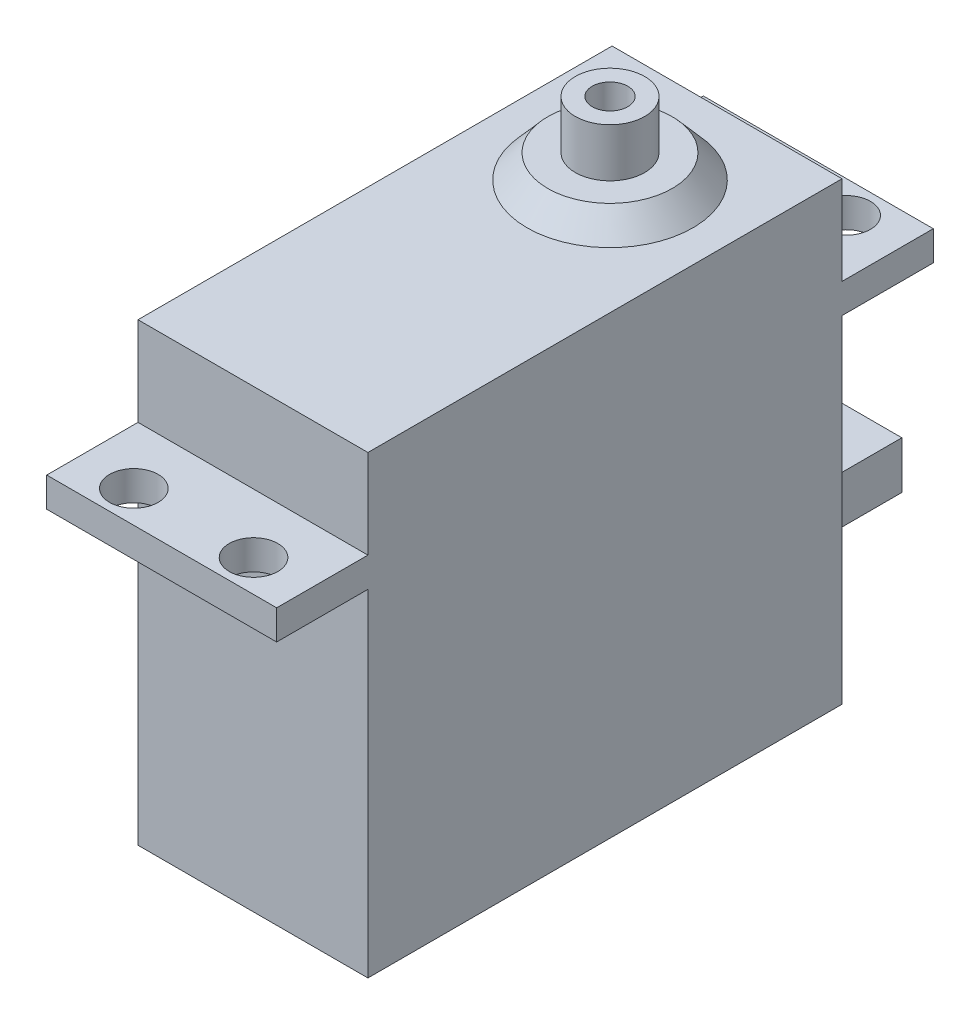
ISO-10303-21;
HEADER;
FILE_DESCRIPTION(('STEP AP214'),'2;1');
FILE_NAME('part.step','',(''),(''),'','','');
FILE_SCHEMA(('AUTOMOTIVE_DESIGN { 1 0 10303 214 1 1 1 1 }'));
ENDSEC;
DATA;
#1=APPLICATION_CONTEXT('core data for automotive mechanical design processes');
#2=APPLICATION_PROTOCOL_DEFINITION('international standard','automotive_design',2000,#1);
#3=PRODUCT_CONTEXT('',#1,'mechanical');
#4=PRODUCT('Part','Part','',(#3));
#5=PRODUCT_RELATED_PRODUCT_CATEGORY('part','',(#4));
#6=PRODUCT_DEFINITION_FORMATION('','',#4);
#7=PRODUCT_DEFINITION_CONTEXT('part definition',#1,'design');
#8=PRODUCT_DEFINITION('design','',#6,#7);
#9=PRODUCT_DEFINITION_SHAPE('','',#8);
#10=(LENGTH_UNIT() NAMED_UNIT(*) SI_UNIT(.MILLI.,.METRE.));
#11=(NAMED_UNIT(*) PLANE_ANGLE_UNIT() SI_UNIT($,.RADIAN.));
#12=(NAMED_UNIT(*) SI_UNIT($,.STERADIAN.) SOLID_ANGLE_UNIT());
#13=UNCERTAINTY_MEASURE_WITH_UNIT(LENGTH_MEASURE(1.E-05),#10,'distance_accuracy_value','');
#14=(GEOMETRIC_REPRESENTATION_CONTEXT(3) GLOBAL_UNCERTAINTY_ASSIGNED_CONTEXT((#13)) GLOBAL_UNIT_ASSIGNED_CONTEXT((#10,
#11,#12)) REPRESENTATION_CONTEXT('',''));
#15=CARTESIAN_POINT('',(0.,0.,0.));
#16=DIRECTION('',(0.,0.,1.));
#17=DIRECTION('',(1.,0.,0.));
#18=AXIS2_PLACEMENT_3D('',#15,#16,#17);
#19=CARTESIAN_POINT('',(0.,-28.4,-20.));
#20=DIRECTION('',(0.,0.,1.));
#21=DIRECTION('',(1.,0.,0.));
#22=AXIS2_PLACEMENT_3D('',#19,#20,#21);
#23=PLANE('',#22);
#24=DIRECTION('',(1.,0.,0.));
#25=VECTOR('',#24,1.);
#26=CARTESIAN_POINT('',(0.,0.,-20.));
#27=LINE('',#26,#25);
#28=CARTESIAN_POINT('',(-9.7,0.,-20.));
#29=VERTEX_POINT('',#28);
#30=CARTESIAN_POINT('',(9.7,0.,-20.));
#31=VERTEX_POINT('',#30);
#32=EDGE_CURVE('E480',#29,#31,#27,.T.);
#33=ORIENTED_EDGE('',*,*,#32,.T.);
#34=DIRECTION('',(0.,1.,0.));
#35=VECTOR('',#34,1.);
#36=CARTESIAN_POINT('',(9.7,-28.4,-20.));
#37=LINE('',#36,#35);
#38=CARTESIAN_POINT('',(9.7,-28.4,-20.));
#39=VERTEX_POINT('',#38);
#40=EDGE_CURVE('E500',#39,#31,#37,.T.);
#41=ORIENTED_EDGE('',*,*,#40,.F.);
#42=DIRECTION('',(1.,0.,0.));
#43=VECTOR('',#42,1.);
#44=CARTESIAN_POINT('',(0.,-28.4,-20.));
#45=LINE('',#44,#43);
#46=CARTESIAN_POINT('',(-9.7,-28.4,-20.));
#47=VERTEX_POINT('',#46);
#48=EDGE_CURVE('E491',#47,#39,#45,.T.);
#49=ORIENTED_EDGE('',*,*,#48,.F.);
#50=DIRECTION('',(0.,1.,0.));
#51=VECTOR('',#50,1.);
#52=CARTESIAN_POINT('',(-9.7,-28.4,-20.));
#53=LINE('',#52,#51);
#54=EDGE_CURVE('E508',#47,#29,#53,.T.);
#55=ORIENTED_EDGE('',*,*,#54,.T.);
#56=EDGE_LOOP('',(#33,#41,#49,#55));
#57=FACE_BOUND('',#56,.T.);
#58=DIRECTION('',(0.,1.,0.));
#59=VECTOR('',#58,1.);
#60=CARTESIAN_POINT('',(-4.,-17.4,-20.));
#61=LINE('',#60,#59);
#62=CARTESIAN_POINT('',(-4.,-23.4,-20.));
#63=VERTEX_POINT('',#62);
#64=CARTESIAN_POINT('',(-4.,-17.4,-20.));
#65=VERTEX_POINT('',#64);
#66=EDGE_CURVE('E207',#63,#65,#61,.T.);
#67=ORIENTED_EDGE('',*,*,#66,.F.);
#68=DIRECTION('',(-1.,0.,0.));
#69=VECTOR('',#68,1.);
#70=CARTESIAN_POINT('',(4.,-23.4,-20.));
#71=LINE('',#70,#69);
#72=CARTESIAN_POINT('',(4.,-23.4,-20.));
#73=VERTEX_POINT('',#72);
#74=EDGE_CURVE('E220',#73,#63,#71,.T.);
#75=ORIENTED_EDGE('',*,*,#74,.F.);
#76=DIRECTION('',(0.,-1.,0.));
#77=VECTOR('',#76,1.);
#78=CARTESIAN_POINT('',(4.,-17.4,-20.));
#79=LINE('',#78,#77);
#80=CARTESIAN_POINT('',(4.,-17.4,-20.));
#81=VERTEX_POINT('',#80);
#82=EDGE_CURVE('E229',#81,#73,#79,.T.);
#83=ORIENTED_EDGE('',*,*,#82,.F.);
#84=DIRECTION('',(1.,0.,0.));
#85=VECTOR('',#84,1.);
#86=CARTESIAN_POINT('',(4.,-17.4,-20.));
#87=LINE('',#86,#85);
#88=EDGE_CURVE('E210',#65,#81,#87,.T.);
#89=ORIENTED_EDGE('',*,*,#88,.F.);
#90=EDGE_LOOP('',(#67,#75,#83,#89));
#91=FACE_BOUND('',#90,.T.);
#92=ADVANCED_FACE('F49',(#57,#91),#23,.F.);
#93=CARTESIAN_POINT('',(0.,2.5,0.));
#94=DIRECTION('',(0.,1.,0.));
#95=DIRECTION('',(0.,0.,1.));
#96=AXIS2_PLACEMENT_3D('',#93,#94,#95);
#97=PLANE('',#96);
#98=CARTESIAN_POINT('',(-5.05,2.5,25.));
#99=DIRECTION('',(0.,1.,0.));
#100=DIRECTION('',(0.,0.,1.));
#101=AXIS2_PLACEMENT_3D('',#98,#99,#100);
#102=CIRCLE('',#101,2.05);
#103=CARTESIAN_POINT('',(-5.05,2.5,27.05));
#104=VERTEX_POINT('',#103);
#105=EDGE_CURVE('E526',#104,#104,#102,.F.);
#106=ORIENTED_EDGE('',*,*,#105,.T.);
#107=EDGE_LOOP('',(#106));
#108=FACE_BOUND('',#107,.T.);
#109=CARTESIAN_POINT('',(5.05,2.5,25.));
#110=DIRECTION('',(0.,1.,0.));
#111=DIRECTION('',(0.,0.,1.));
#112=AXIS2_PLACEMENT_3D('',#109,#110,#111);
#113=CIRCLE('',#112,2.05);
#114=CARTESIAN_POINT('',(5.05,2.5,27.05));
#115=VERTEX_POINT('',#114);
#116=EDGE_CURVE('E523',#115,#115,#113,.F.);
#117=ORIENTED_EDGE('',*,*,#116,.T.);
#118=EDGE_LOOP('',(#117));
#119=FACE_BOUND('',#118,.T.);
#120=DIRECTION('',(0.,0.,1.));
#121=VECTOR('',#120,1.);
#122=CARTESIAN_POINT('',(9.7,2.5,0.));
#123=LINE('',#122,#121);
#124=CARTESIAN_POINT('',(9.7,2.5,20.));
#125=VERTEX_POINT('',#124);
#126=CARTESIAN_POINT('',(9.7,2.5,27.7));
#127=VERTEX_POINT('',#126);
#128=EDGE_CURVE('E438',#125,#127,#123,.T.);
#129=ORIENTED_EDGE('',*,*,#128,.F.);
#130=DIRECTION('',(-1.,0.,0.));
#131=VECTOR('',#130,1.);
#132=CARTESIAN_POINT('',(0.,2.5,20.));
#133=LINE('',#132,#131);
#134=CARTESIAN_POINT('',(-9.69999999999999,2.5,20.));
#135=VERTEX_POINT('',#134);
#136=EDGE_CURVE('E461',#125,#135,#133,.T.);
#137=ORIENTED_EDGE('',*,*,#136,.T.);
#138=DIRECTION('',(0.,0.,1.));
#139=VECTOR('',#138,1.);
#140=CARTESIAN_POINT('',(-9.69999999999999,2.5,0.));
#141=LINE('',#140,#139);
#142=CARTESIAN_POINT('',(-9.69999999999999,2.5,27.7));
#143=VERTEX_POINT('',#142);
#144=EDGE_CURVE('E517',#135,#143,#141,.T.);
#145=ORIENTED_EDGE('',*,*,#144,.T.);
#146=DIRECTION('',(1.,0.,0.));
#147=VECTOR('',#146,1.);
#148=CARTESIAN_POINT('',(0.,2.5,27.7));
#149=LINE('',#148,#147);
#150=EDGE_CURVE('E520',#143,#127,#149,.T.);
#151=ORIENTED_EDGE('',*,*,#150,.T.);
#152=EDGE_LOOP('',(#129,#137,#145,#151));
#153=FACE_BOUND('',#152,.T.);
#154=ADVANCED_FACE('F364',(#108,#119,#153),#97,.T.);
#155=CARTESIAN_POINT('',(0.,0.,0.));
#156=DIRECTION('',(0.,1.,0.));
#157=DIRECTION('',(0.,0.,1.));
#158=AXIS2_PLACEMENT_3D('',#155,#156,#157);
#159=PLANE('',#158);
#160=CARTESIAN_POINT('',(-5.05,0.,-25.));
#161=DIRECTION('',(0.,1.,0.));
#162=DIRECTION('',(0.,0.,1.));
#163=AXIS2_PLACEMENT_3D('',#160,#161,#162);
#164=CIRCLE('',#163,2.05);
#165=CARTESIAN_POINT('',(-5.05,0.,-22.95));
#166=VERTEX_POINT('',#165);
#167=EDGE_CURVE('E432',#166,#166,#164,.T.);
#168=ORIENTED_EDGE('',*,*,#167,.T.);
#169=EDGE_LOOP('',(#168));
#170=FACE_BOUND('',#169,.T.);
#171=CARTESIAN_POINT('',(5.05,0.,-25.));
#172=DIRECTION('',(0.,1.,0.));
#173=DIRECTION('',(0.,0.,1.));
#174=AXIS2_PLACEMENT_3D('',#171,#172,#173);
#175=CIRCLE('',#174,2.05);
#176=CARTESIAN_POINT('',(5.05,0.,-22.95));
#177=VERTEX_POINT('',#176);
#178=EDGE_CURVE('E435',#177,#177,#175,.T.);
#179=ORIENTED_EDGE('',*,*,#178,.T.);
#180=EDGE_LOOP('',(#179));
#181=FACE_BOUND('',#180,.T.);
#182=ORIENTED_EDGE('',*,*,#32,.F.);
#183=DIRECTION('',(0.,0.,1.));
#184=VECTOR('',#183,1.);
#185=CARTESIAN_POINT('',(-9.69999999999999,0.,0.));
#186=LINE('',#185,#184);
#187=CARTESIAN_POINT('',(-9.69999999999999,0.,-27.7));
#188=VERTEX_POINT('',#187);
#189=EDGE_CURVE('E416',#188,#29,#186,.T.);
#190=ORIENTED_EDGE('',*,*,#189,.F.);
#191=DIRECTION('',(1.,0.,0.));
#192=VECTOR('',#191,1.);
#193=CARTESIAN_POINT('',(0.,0.,-27.7));
#194=LINE('',#193,#192);
#195=CARTESIAN_POINT('',(9.7,0.,-27.7));
#196=VERTEX_POINT('',#195);
#197=EDGE_CURVE('E406',#188,#196,#194,.T.);
#198=ORIENTED_EDGE('',*,*,#197,.T.);
#199=DIRECTION('',(0.,0.,1.));
#200=VECTOR('',#199,1.);
#201=CARTESIAN_POINT('',(9.7,0.,0.));
#202=LINE('',#201,#200);
#203=EDGE_CURVE('E414',#196,#31,#202,.T.);
#204=ORIENTED_EDGE('',*,*,#203,.T.);
#205=EDGE_LOOP('',(#182,#190,#198,#204));
#206=FACE_BOUND('',#205,.T.);
#207=ADVANCED_FACE('F374',(#170,#181,#206),#159,.F.);
#208=CARTESIAN_POINT('',(9.7,2.5,0.));
#209=DIRECTION('',(1.,0.,0.));
#210=DIRECTION('',(0.,0.,-1.));
#211=AXIS2_PLACEMENT_3D('',#208,#209,#210);
#212=PLANE('',#211);
#213=ORIENTED_EDGE('',*,*,#203,.F.);
#214=DIRECTION('',(0.,-1.,0.));
#215=VECTOR('',#214,1.);
#216=CARTESIAN_POINT('',(9.7,2.5,-27.7));
#217=LINE('',#216,#215);
#218=CARTESIAN_POINT('',(9.7,2.5,-27.7));
#219=VERTEX_POINT('',#218);
#220=EDGE_CURVE('E12',#219,#196,#217,.T.);
#221=ORIENTED_EDGE('',*,*,#220,.F.);
#222=CARTESIAN_POINT('',(9.7,2.5,-20.));
#223=VERTEX_POINT('',#222);
#224=EDGE_CURVE('E512',#219,#223,#123,.T.);
#225=ORIENTED_EDGE('',*,*,#224,.T.);
#226=DIRECTION('',(0.,-1.,0.));
#227=VECTOR('',#226,1.);
#228=CARTESIAN_POINT('',(9.7,10.,-20.));
#229=LINE('',#228,#227);
#230=CARTESIAN_POINT('',(9.7,10.,-20.));
#231=VERTEX_POINT('',#230);
#232=EDGE_CURVE('E481',#231,#223,#229,.T.);
#233=ORIENTED_EDGE('',*,*,#232,.F.);
#234=DIRECTION('',(0.,0.,-1.));
#235=VECTOR('',#234,1.);
#236=CARTESIAN_POINT('',(9.7,10.,0.));
#237=LINE('',#236,#235);
#238=CARTESIAN_POINT('',(9.7,10.,20.));
#239=VERTEX_POINT('',#238);
#240=EDGE_CURVE('E471',#239,#231,#237,.T.);
#241=ORIENTED_EDGE('',*,*,#240,.F.);
#242=DIRECTION('',(0.,-1.,0.));
#243=VECTOR('',#242,1.);
#244=CARTESIAN_POINT('',(9.7,10.,20.));
#245=LINE('',#244,#243);
#246=EDGE_CURVE('E477',#239,#125,#245,.T.);
#247=ORIENTED_EDGE('',*,*,#246,.T.);
#248=ORIENTED_EDGE('',*,*,#128,.T.);
#249=DIRECTION('',(0.,-1.,0.));
#250=VECTOR('',#249,1.);
#251=CARTESIAN_POINT('',(9.7,2.5,27.7));
#252=LINE('',#251,#250);
#253=CARTESIAN_POINT('',(9.7,0.,27.7));
#254=VERTEX_POINT('',#253);
#255=EDGE_CURVE('E439',#127,#254,#252,.T.);
#256=ORIENTED_EDGE('',*,*,#255,.T.);
#257=CARTESIAN_POINT('',(9.7,0.,20.));
#258=VERTEX_POINT('',#257);
#259=EDGE_CURVE('E418',#258,#254,#202,.T.);
#260=ORIENTED_EDGE('',*,*,#259,.F.);
#261=DIRECTION('',(0.,1.,0.));
#262=VECTOR('',#261,1.);
#263=CARTESIAN_POINT('',(9.7,-28.4,20.));
#264=LINE('',#263,#262);
#265=CARTESIAN_POINT('',(9.7,-28.4,20.));
#266=VERTEX_POINT('',#265);
#267=EDGE_CURVE('E504',#266,#258,#264,.T.);
#268=ORIENTED_EDGE('',*,*,#267,.F.);
#269=DIRECTION('',(0.,0.,1.));
#270=VECTOR('',#269,1.);
#271=CARTESIAN_POINT('',(9.7,-28.4,0.));
#272=LINE('',#271,#270);
#273=EDGE_CURVE('E489',#39,#266,#272,.T.);
#274=ORIENTED_EDGE('',*,*,#273,.F.);
#275=ORIENTED_EDGE('',*,*,#40,.T.);
#276=EDGE_LOOP('',(#213,#221,#225,#233,#241,#247,#248,#256,#260,#268,#274,#275));
#277=FACE_BOUND('',#276,.T.);
#278=ADVANCED_FACE('F51',(#277),#212,.T.);
#279=CARTESIAN_POINT('',(0.,2.5,-27.7));
#280=DIRECTION('',(0.,0.,-1.));
#281=DIRECTION('',(-1.,0.,0.));
#282=AXIS2_PLACEMENT_3D('',#279,#280,#281);
#283=PLANE('',#282);
#284=ORIENTED_EDGE('',*,*,#197,.F.);
#285=DIRECTION('',(0.,-1.,0.));
#286=VECTOR('',#285,1.);
#287=CARTESIAN_POINT('',(-9.69999999999999,2.5,-27.7));
#288=LINE('',#287,#286);
#289=CARTESIAN_POINT('',(-9.69999999999999,2.5,-27.7));
#290=VERTEX_POINT('',#289);
#291=EDGE_CURVE('E58',#290,#188,#288,.T.);
#292=ORIENTED_EDGE('',*,*,#291,.F.);
#293=DIRECTION('',(1.,0.,0.));
#294=VECTOR('',#293,1.);
#295=CARTESIAN_POINT('',(0.,2.5,-27.7));
#296=LINE('',#295,#294);
#297=EDGE_CURVE('E515',#290,#219,#296,.T.);
#298=ORIENTED_EDGE('',*,*,#297,.T.);
#299=ORIENTED_EDGE('',*,*,#220,.T.);
#300=EDGE_LOOP('',(#284,#292,#298,#299));
#301=FACE_BOUND('',#300,.T.);
#302=ADVANCED_FACE('F396',(#301),#283,.T.);
#303=CARTESIAN_POINT('',(-9.69999999999999,2.5,0.));
#304=DIRECTION('',(1.,0.,0.));
#305=DIRECTION('',(0.,0.,-1.));
#306=AXIS2_PLACEMENT_3D('',#303,#304,#305);
#307=PLANE('',#306);
#308=ORIENTED_EDGE('',*,*,#189,.T.);
#309=ORIENTED_EDGE('',*,*,#54,.F.);
#310=DIRECTION('',(0.,0.,1.));
#311=VECTOR('',#310,1.);
#312=CARTESIAN_POINT('',(-9.69999999999999,-28.4,0.));
#313=LINE('',#312,#311);
#314=CARTESIAN_POINT('',(-9.69999999999999,-28.4,20.));
#315=VERTEX_POINT('',#314);
#316=EDGE_CURVE('E494',#47,#315,#313,.T.);
#317=ORIENTED_EDGE('',*,*,#316,.T.);
#318=DIRECTION('',(0.,1.,0.));
#319=VECTOR('',#318,1.);
#320=CARTESIAN_POINT('',(-9.69999999999999,-28.4,20.));
#321=LINE('',#320,#319);
#322=CARTESIAN_POINT('',(-9.69999999999999,0.,20.));
#323=VERTEX_POINT('',#322);
#324=EDGE_CURVE('E506',#315,#323,#321,.T.);
#325=ORIENTED_EDGE('',*,*,#324,.T.);
#326=CARTESIAN_POINT('',(-9.69999999999999,0.,27.7));
#327=VERTEX_POINT('',#326);
#328=EDGE_CURVE('E413',#323,#327,#186,.T.);
#329=ORIENTED_EDGE('',*,*,#328,.T.);
#330=DIRECTION('',(0.,-1.,0.));
#331=VECTOR('',#330,1.);
#332=CARTESIAN_POINT('',(-9.69999999999999,2.5,27.7));
#333=LINE('',#332,#331);
#334=EDGE_CURVE('E442',#143,#327,#333,.T.);
#335=ORIENTED_EDGE('',*,*,#334,.F.);
#336=ORIENTED_EDGE('',*,*,#144,.F.);
#337=DIRECTION('',(0.,-1.,0.));
#338=VECTOR('',#337,1.);
#339=CARTESIAN_POINT('',(-9.69999999999999,10.,20.));
#340=LINE('',#339,#338);
#341=CARTESIAN_POINT('',(-9.69999999999999,10.,20.));
#342=VERTEX_POINT('',#341);
#343=EDGE_CURVE('E473',#342,#135,#340,.T.);
#344=ORIENTED_EDGE('',*,*,#343,.F.);
#345=DIRECTION('',(0.,0.,-1.));
#346=VECTOR('',#345,1.);
#347=CARTESIAN_POINT('',(-9.69999999999999,10.,0.));
#348=LINE('',#347,#346);
#349=CARTESIAN_POINT('',(-9.7,10.,-20.));
#350=VERTEX_POINT('',#349);
#351=EDGE_CURVE('E465',#342,#350,#348,.T.);
#352=ORIENTED_EDGE('',*,*,#351,.T.);
#353=DIRECTION('',(0.,-1.,0.));
#354=VECTOR('',#353,1.);
#355=CARTESIAN_POINT('',(-9.7,10.,-20.));
#356=LINE('',#355,#354);
#357=CARTESIAN_POINT('',(-9.7,2.5,-20.));
#358=VERTEX_POINT('',#357);
#359=EDGE_CURVE('E484',#350,#358,#356,.T.);
#360=ORIENTED_EDGE('',*,*,#359,.T.);
#361=EDGE_CURVE('E518',#290,#358,#141,.T.);
#362=ORIENTED_EDGE('',*,*,#361,.F.);
#363=ORIENTED_EDGE('',*,*,#291,.T.);
#364=EDGE_LOOP('',(#308,#309,#317,#325,#329,#335,#336,#344,#352,#360,#362,#363));
#365=FACE_BOUND('',#364,.T.);
#366=ADVANCED_FACE('F383',(#365),#307,.F.);
#367=CARTESIAN_POINT('',(-5.05,2.5,-25.));
#368=DIRECTION('',(0.,-1.,0.));
#369=DIRECTION('',(0.,0.,-1.));
#370=AXIS2_PLACEMENT_3D('',#367,#368,#369);
#371=CYLINDRICAL_SURFACE('',#370,2.05);
#372=CARTESIAN_POINT('',(-5.05,2.5,-25.));
#373=DIRECTION('',(0.,1.,0.));
#374=DIRECTION('',(0.,0.,1.));
#375=AXIS2_PLACEMENT_3D('',#372,#373,#374);
#376=CIRCLE('',#375,2.05);
#377=CARTESIAN_POINT('',(-5.05,2.5,-22.95));
#378=VERTEX_POINT('',#377);
#379=EDGE_CURVE('E529',#378,#378,#376,.T.);
#380=ORIENTED_EDGE('',*,*,#379,.T.);
#381=EDGE_LOOP('',(#380));
#382=FACE_BOUND('',#381,.T.);
#383=ORIENTED_EDGE('',*,*,#167,.F.);
#384=EDGE_LOOP('',(#383));
#385=FACE_BOUND('',#384,.T.);
#386=ADVANCED_FACE('F379',(#382,#385),#371,.F.);
#387=CARTESIAN_POINT('',(-5.05,2.5,25.));
#388=DIRECTION('',(0.,-1.,0.));
#389=DIRECTION('',(0.,0.,-1.));
#390=AXIS2_PLACEMENT_3D('',#387,#388,#389);
#391=CYLINDRICAL_SURFACE('',#390,2.05);
#392=ORIENTED_EDGE('',*,*,#105,.F.);
#393=EDGE_LOOP('',(#392));
#394=FACE_BOUND('',#393,.T.);
#395=CARTESIAN_POINT('',(-5.05,0.,25.));
#396=DIRECTION('',(0.,1.,0.));
#397=DIRECTION('',(0.,0.,1.));
#398=AXIS2_PLACEMENT_3D('',#395,#396,#397);
#399=CIRCLE('',#398,2.05);
#400=CARTESIAN_POINT('',(-5.05,0.,27.05));
#401=VERTEX_POINT('',#400);
#402=EDGE_CURVE('E429',#401,#401,#399,.F.);
#403=ORIENTED_EDGE('',*,*,#402,.T.);
#404=EDGE_LOOP('',(#403));
#405=FACE_BOUND('',#404,.T.);
#406=ADVANCED_FACE('F382',(#394,#405),#391,.F.);
#407=CARTESIAN_POINT('',(5.05,2.5,25.));
#408=DIRECTION('',(0.,-1.,0.));
#409=DIRECTION('',(0.,0.,-1.));
#410=AXIS2_PLACEMENT_3D('',#407,#408,#409);
#411=CYLINDRICAL_SURFACE('',#410,2.05);
#412=ORIENTED_EDGE('',*,*,#116,.F.);
#413=EDGE_LOOP('',(#412));
#414=FACE_BOUND('',#413,.T.);
#415=CARTESIAN_POINT('',(5.05,0.,25.));
#416=DIRECTION('',(0.,1.,0.));
#417=DIRECTION('',(0.,0.,1.));
#418=AXIS2_PLACEMENT_3D('',#415,#416,#417);
#419=CIRCLE('',#418,2.05);
#420=CARTESIAN_POINT('',(5.05,0.,27.05));
#421=VERTEX_POINT('',#420);
#422=EDGE_CURVE('E426',#421,#421,#419,.F.);
#423=ORIENTED_EDGE('',*,*,#422,.T.);
#424=EDGE_LOOP('',(#423));
#425=FACE_BOUND('',#424,.T.);
#426=ADVANCED_FACE('F387',(#414,#425),#411,.F.);
#427=CARTESIAN_POINT('',(0.,2.5,27.7));
#428=DIRECTION('',(0.,0.,-1.));
#429=DIRECTION('',(-1.,0.,0.));
#430=AXIS2_PLACEMENT_3D('',#427,#428,#429);
#431=PLANE('',#430);
#432=DIRECTION('',(1.,0.,0.));
#433=VECTOR('',#432,1.);
#434=CARTESIAN_POINT('',(0.,0.,27.7));
#435=LINE('',#434,#433);
#436=EDGE_CURVE('E423',#327,#254,#435,.T.);
#437=ORIENTED_EDGE('',*,*,#436,.T.);
#438=ORIENTED_EDGE('',*,*,#255,.F.);
#439=ORIENTED_EDGE('',*,*,#150,.F.);
#440=ORIENTED_EDGE('',*,*,#334,.T.);
#441=EDGE_LOOP('',(#437,#438,#439,#440));
#442=FACE_BOUND('',#441,.T.);
#443=ADVANCED_FACE('F377',(#442),#431,.F.);
#444=CARTESIAN_POINT('',(5.05,2.5,-25.));
#445=DIRECTION('',(0.,-1.,0.));
#446=DIRECTION('',(0.,0.,-1.));
#447=AXIS2_PLACEMENT_3D('',#444,#445,#446);
#448=CYLINDRICAL_SURFACE('',#447,2.05);
#449=CARTESIAN_POINT('',(5.05,2.5,-25.));
#450=DIRECTION('',(0.,1.,0.));
#451=DIRECTION('',(0.,0.,1.));
#452=AXIS2_PLACEMENT_3D('',#449,#450,#451);
#453=CIRCLE('',#452,2.05);
#454=CARTESIAN_POINT('',(5.05,2.5,-22.95));
#455=VERTEX_POINT('',#454);
#456=EDGE_CURVE('E443',#455,#455,#453,.T.);
#457=ORIENTED_EDGE('',*,*,#456,.T.);
#458=EDGE_LOOP('',(#457));
#459=FACE_BOUND('',#458,.T.);
#460=ORIENTED_EDGE('',*,*,#178,.F.);
#461=EDGE_LOOP('',(#460));
#462=FACE_BOUND('',#461,.T.);
#463=ADVANCED_FACE('F369',(#459,#462),#448,.F.);
#464=DIRECTION('',(-1.,0.,0.));
#465=VECTOR('',#464,1.);
#466=CARTESIAN_POINT('',(0.,2.5,-20.));
#467=LINE('',#466,#465);
#468=EDGE_CURVE('E466',#223,#358,#467,.T.);
#469=ORIENTED_EDGE('',*,*,#468,.F.);
#470=ORIENTED_EDGE('',*,*,#224,.F.);
#471=ORIENTED_EDGE('',*,*,#297,.F.);
#472=ORIENTED_EDGE('',*,*,#361,.T.);
#473=EDGE_LOOP('',(#469,#470,#471,#472));
#474=FACE_BOUND('',#473,.T.);
#475=ORIENTED_EDGE('',*,*,#379,.F.);
#476=EDGE_LOOP('',(#475));
#477=FACE_BOUND('',#476,.T.);
#478=ORIENTED_EDGE('',*,*,#456,.F.);
#479=EDGE_LOOP('',(#478));
#480=FACE_BOUND('',#479,.T.);
#481=ADVANCED_FACE('F366',(#474,#477,#480),#97,.T.);
#482=ORIENTED_EDGE('',*,*,#328,.F.);
#483=DIRECTION('',(1.,0.,0.));
#484=VECTOR('',#483,1.);
#485=CARTESIAN_POINT('',(0.,0.,20.));
#486=LINE('',#485,#484);
#487=EDGE_CURVE('E492',#323,#258,#486,.T.);
#488=ORIENTED_EDGE('',*,*,#487,.T.);
#489=ORIENTED_EDGE('',*,*,#259,.T.);
#490=ORIENTED_EDGE('',*,*,#436,.F.);
#491=EDGE_LOOP('',(#482,#488,#489,#490));
#492=FACE_BOUND('',#491,.T.);
#493=ORIENTED_EDGE('',*,*,#422,.F.);
#494=EDGE_LOOP('',(#493));
#495=FACE_BOUND('',#494,.T.);
#496=ORIENTED_EDGE('',*,*,#402,.F.);
#497=EDGE_LOOP('',(#496));
#498=FACE_BOUND('',#497,.T.);
#499=ADVANCED_FACE('F360',(#492,#495,#498),#159,.F.);
#500=CARTESIAN_POINT('',(0.,-28.4,20.));
#501=DIRECTION('',(0.,0.,1.));
#502=DIRECTION('',(1.,0.,0.));
#503=AXIS2_PLACEMENT_3D('',#500,#501,#502);
#504=PLANE('',#503);
#505=ORIENTED_EDGE('',*,*,#487,.F.);
#506=ORIENTED_EDGE('',*,*,#324,.F.);
#507=DIRECTION('',(1.,0.,0.));
#508=VECTOR('',#507,1.);
#509=CARTESIAN_POINT('',(0.,-28.4,20.));
#510=LINE('',#509,#508);
#511=EDGE_CURVE('E497',#315,#266,#510,.T.);
#512=ORIENTED_EDGE('',*,*,#511,.T.);
#513=ORIENTED_EDGE('',*,*,#267,.T.);
#514=EDGE_LOOP('',(#505,#506,#512,#513));
#515=FACE_BOUND('',#514,.T.);
#516=ADVANCED_FACE('F356',(#515),#504,.T.);
#517=CARTESIAN_POINT('',(0.,-28.4,0.));
#518=DIRECTION('',(0.,1.,0.));
#519=DIRECTION('',(0.,0.,1.));
#520=AXIS2_PLACEMENT_3D('',#517,#518,#519);
#521=PLANE('',#520);
#522=CARTESIAN_POINT('',(0.,-28.4,-10.125));
#523=DIRECTION('',(0.,-1.,0.));
#524=DIRECTION('',(0.,0.,-1.));
#525=AXIS2_PLACEMENT_3D('',#522,#523,#524);
#526=CIRCLE('',#525,7.);
#527=CARTESIAN_POINT('',(1.46255123281688,-28.4,-3.27949462118495));
#528=VERTEX_POINT('',#527);
#529=EDGE_CURVE('E304',#528,#528,#526,.T.);
#530=ORIENTED_EDGE('',*,*,#529,.F.);
#531=EDGE_LOOP('',(#530));
#532=FACE_BOUND('',#531,.T.);
#533=ORIENTED_EDGE('',*,*,#273,.T.);
#534=ORIENTED_EDGE('',*,*,#511,.F.);
#535=ORIENTED_EDGE('',*,*,#316,.F.);
#536=ORIENTED_EDGE('',*,*,#48,.T.);
#537=EDGE_LOOP('',(#533,#534,#535,#536));
#538=FACE_BOUND('',#537,.T.);
#539=ADVANCED_FACE('F352',(#532,#538),#521,.F.);
#540=CARTESIAN_POINT('',(0.,10.,20.));
#541=DIRECTION('',(0.,0.,1.));
#542=DIRECTION('',(1.,0.,0.));
#543=AXIS2_PLACEMENT_3D('',#540,#541,#542);
#544=PLANE('',#543);
#545=ORIENTED_EDGE('',*,*,#136,.F.);
#546=ORIENTED_EDGE('',*,*,#246,.F.);
#547=DIRECTION('',(-1.,0.,0.));
#548=VECTOR('',#547,1.);
#549=CARTESIAN_POINT('',(0.,10.,20.));
#550=LINE('',#549,#548);
#551=EDGE_CURVE('E462',#239,#342,#550,.T.);
#552=ORIENTED_EDGE('',*,*,#551,.T.);
#553=ORIENTED_EDGE('',*,*,#343,.T.);
#554=EDGE_LOOP('',(#545,#546,#552,#553));
#555=FACE_BOUND('',#554,.T.);
#556=ADVANCED_FACE('F348',(#555),#544,.T.);
#557=CARTESIAN_POINT('',(0.,10.,-20.));
#558=DIRECTION('',(0.,0.,1.));
#559=DIRECTION('',(1.,0.,0.));
#560=AXIS2_PLACEMENT_3D('',#557,#558,#559);
#561=PLANE('',#560);
#562=ORIENTED_EDGE('',*,*,#468,.T.);
#563=ORIENTED_EDGE('',*,*,#359,.F.);
#564=DIRECTION('',(-1.,0.,0.));
#565=VECTOR('',#564,1.);
#566=CARTESIAN_POINT('',(0.,10.,-20.));
#567=LINE('',#566,#565);
#568=EDGE_CURVE('E469',#231,#350,#567,.T.);
#569=ORIENTED_EDGE('',*,*,#568,.F.);
#570=ORIENTED_EDGE('',*,*,#232,.T.);
#571=EDGE_LOOP('',(#562,#563,#569,#570));
#572=FACE_BOUND('',#571,.T.);
#573=ADVANCED_FACE('F344',(#572),#561,.F.);
#574=CARTESIAN_POINT('',(0.,10.,0.));
#575=DIRECTION('',(0.,-1.,0.));
#576=DIRECTION('',(0.,0.,-1.));
#577=AXIS2_PLACEMENT_3D('',#574,#575,#576);
#578=PLANE('',#577);
#579=CARTESIAN_POINT('',(0.,10.,-10.125));
#580=DIRECTION('',(0.,1.,0.));
#581=DIRECTION('',(0.,0.,1.));
#582=AXIS2_PLACEMENT_3D('',#579,#580,#581);
#583=CIRCLE('',#582,7.);
#584=CARTESIAN_POINT('',(0.,10.,-3.125));
#585=VERTEX_POINT('',#584);
#586=EDGE_CURVE('E257',#585,#585,#583,.T.);
#587=ORIENTED_EDGE('',*,*,#586,.F.);
#588=EDGE_LOOP('',(#587));
#589=FACE_BOUND('',#588,.T.);
#590=ORIENTED_EDGE('',*,*,#551,.F.);
#591=ORIENTED_EDGE('',*,*,#240,.T.);
#592=ORIENTED_EDGE('',*,*,#568,.T.);
#593=ORIENTED_EDGE('',*,*,#351,.F.);
#594=EDGE_LOOP('',(#590,#591,#592,#593));
#595=FACE_BOUND('',#594,.T.);
#596=ADVANCED_FACE('F327',(#589,#595),#578,.F.);
#597=CARTESIAN_POINT('',(1.46255123281688,-28.4,-3.27949462118495));
#598=CARTESIAN_POINT('',(2.26700558557866,-31.4,-6.8294445574448));
#599=CARTESIAN_POINT('',(-12.2284595248132,-28.4,-0.354392155551182));
#600=CARTESIAN_POINT('',(-4.32410529953173,-31.4,-2.29543338628749));
#601=CARTESIAN_POINT('',(-15.153561990447,-28.4,-14.0454029131813));
#602=CARTESIAN_POINT('',(-8.85811647068904,-31.4,-8.88654427139788));
#603=CARTESIAN_POINT('',(-1.46255123281688,-28.4,-16.9705053788151));
#604=CARTESIAN_POINT('',(-2.26700558557866,-31.4,-13.4205554425552));
#605=CARTESIAN_POINT('',(12.2284595248132,-28.4,-19.8956078444488));
#606=CARTESIAN_POINT('',(4.32410529953173,-31.4,-17.9545666137125));
#607=CARTESIAN_POINT('',(15.153561990447,-28.4,-6.2045970868187));
#608=CARTESIAN_POINT('',(8.85811647068905,-31.4,-11.3634557286021));
#609=CARTESIAN_POINT('',(1.46255123281688,-28.4,-3.27949462118495));
#610=CARTESIAN_POINT('',(2.26700558557866,-31.4,-6.8294445574448));
#611=(BOUNDED_SURFACE() B_SPLINE_SURFACE(3,1,((#597,#598),(#599,#600),(#601,#602),(#603,#604),
(#605,#606),(#607,#608),(#609,#610)),.UNSPECIFIED.,.T.,.F.,.F.) B_SPLINE_SURFACE_WITH_KNOTS((4,
3,4),(2,2),(0.,0.5,1.),(0.,1.),
.UNSPECIFIED.) GEOMETRIC_REPRESENTATION_ITEM() RATIONAL_B_SPLINE_SURFACE(((1.,1.),
(0.333333333333333,0.333333333333334),(0.333333333333333,0.333333333333334),(1.,1.),
(0.333333333333333,0.333333333333333),(0.333333333333333,0.333333333333333),(1.,1.))) REPRESENTATION_ITEM('') SURFACE());
#612=CARTESIAN_POINT('',(0.,-31.4,-10.125));
#613=DIRECTION('',(0.,-1.,0.));
#614=DIRECTION('',(0.,0.,-1.));
#615=AXIS2_PLACEMENT_3D('',#612,#613,#614);
#616=CIRCLE('',#615,4.);
#617=CARTESIAN_POINT('',(2.26700558557866,-31.4,-6.8294445574448));
#618=VERTEX_POINT('',#617);
#619=EDGE_CURVE('E309',#618,#618,#616,.T.);
#620=CARTESIAN_POINT('',(1.46255123281688,-28.4,-3.27949462118495));
#621=CARTESIAN_POINT('',(1.47093096565815,-28.43125,-3.31647326635432));
#622=CARTESIAN_POINT('',(1.47931069849942,-28.4625,-3.35345191152369));
#623=CARTESIAN_POINT('',(1.49607016418196,-28.525,-3.42740920186244));
#624=CARTESIAN_POINT('',(1.50444989702322,-28.55625,-3.46438784703181));
#625=CARTESIAN_POINT('',(1.52120936270576,-28.61875,-3.53834513737056));
#626=CARTESIAN_POINT('',(1.52958909554703,-28.65,-3.57532378253993));
#627=CARTESIAN_POINT('',(1.54634856122957,-28.7125,-3.64928107287868));
#628=CARTESIAN_POINT('',(1.55472829407083,-28.74375,-3.68625971804805));
#629=CARTESIAN_POINT('',(1.57148775975337,-28.80625,-3.7602170083868));
#630=CARTESIAN_POINT('',(1.57986749259464,-28.8375,-3.79719565355617));
#631=CARTESIAN_POINT('',(1.59662695827718,-28.9,-3.87115294389492));
#632=CARTESIAN_POINT('',(1.60500669111845,-28.93125,-3.9081315890643));
#633=CARTESIAN_POINT('',(1.62176615680098,-28.99375,-3.98208887940304));
#634=CARTESIAN_POINT('',(1.63014588964225,-29.025,-4.01906752457242));
#635=CARTESIAN_POINT('',(1.64690535532479,-29.0875,-4.09302481491116));
#636=CARTESIAN_POINT('',(1.65528508816606,-29.11875,-4.13000346008054));
#637=CARTESIAN_POINT('',(1.67204455384859,-29.18125,-4.20396075041928));
#638=CARTESIAN_POINT('',(1.68042428668986,-29.2125,-4.24093939558866));
#639=CARTESIAN_POINT('',(1.6971837523724,-29.275,-4.3148966859274));
#640=CARTESIAN_POINT('',(1.70556348521367,-29.30625,-4.35187533109678));
#641=CARTESIAN_POINT('',(1.7223229508962,-29.36875,-4.42583262143553));
#642=CARTESIAN_POINT('',(1.73070268373747,-29.4,-4.4628112666049));
#643=CARTESIAN_POINT('',(1.74746214942001,-29.4625,-4.53676855694364));
#644=CARTESIAN_POINT('',(1.75584188226128,-29.49375,-4.57374720211302));
#645=CARTESIAN_POINT('',(1.77260134794382,-29.55625,-4.64770449245177));
#646=CARTESIAN_POINT('',(1.78098108078508,-29.5875,-4.68468313762114));
#647=CARTESIAN_POINT('',(1.79774054646762,-29.65,-4.75864042795989));
#648=CARTESIAN_POINT('',(1.80612027930889,-29.68125,-4.79561907312926));
#649=CARTESIAN_POINT('',(1.82287974499143,-29.74375,-4.86957636346801));
#650=CARTESIAN_POINT('',(1.83125947783269,-29.775,-4.90655500863738));
#651=CARTESIAN_POINT('',(1.84801894351523,-29.8375,-4.98051229897613));
#652=CARTESIAN_POINT('',(1.8563986763565,-29.86875,-5.0174909441455));
#653=CARTESIAN_POINT('',(1.87315814203904,-29.93125,-5.09144823448425));
#654=CARTESIAN_POINT('',(1.88153787488031,-29.9625,-5.12842687965362));
#655=CARTESIAN_POINT('',(1.89829734056284,-30.025,-5.20238416999237));
#656=CARTESIAN_POINT('',(1.90667707340411,-30.05625,-5.23936281516174));
#657=CARTESIAN_POINT('',(1.92343653908665,-30.11875,-5.31332010550049));
#658=CARTESIAN_POINT('',(1.93181627192792,-30.15,-5.35029875066986));
#659=CARTESIAN_POINT('',(1.94857573761045,-30.2125,-5.42425604100861));
#660=CARTESIAN_POINT('',(1.95695547045172,-30.24375,-5.46123468617798));
#661=CARTESIAN_POINT('',(1.97371493613426,-30.30625,-5.53519197651673));
#662=CARTESIAN_POINT('',(1.98209466897553,-30.3375,-5.5721706216861));
#663=CARTESIAN_POINT('',(1.99885413465806,-30.4,-5.64612791202485));
#664=CARTESIAN_POINT('',(2.00723386749933,-30.43125,-5.68310655719422));
#665=CARTESIAN_POINT('',(2.02399333318187,-30.49375,-5.75706384753297));
#666=CARTESIAN_POINT('',(2.03237306602314,-30.525,-5.79404249270234));
#667=CARTESIAN_POINT('',(2.04913253170568,-30.5875,-5.86799978304109));
#668=CARTESIAN_POINT('',(2.05751226454694,-30.61875,-5.90497842821046));
#669=CARTESIAN_POINT('',(2.07427173022948,-30.68125,-5.97893571854921));
#670=CARTESIAN_POINT('',(2.08265146307075,-30.7125,-6.01591436371859));
#671=CARTESIAN_POINT('',(2.09941092875329,-30.775,-6.08987165405733));
#672=CARTESIAN_POINT('',(2.10779066159455,-30.80625,-6.12685029922671));
#673=CARTESIAN_POINT('',(2.12455012727709,-30.86875,-6.20080758956545));
#674=CARTESIAN_POINT('',(2.13292986011836,-30.9,-6.23778623473483));
#675=CARTESIAN_POINT('',(2.1496893258009,-30.9625,-6.31174352507357));
#676=CARTESIAN_POINT('',(2.15806905864217,-30.99375,-6.34872217024295));
#677=CARTESIAN_POINT('',(2.1748285243247,-31.05625,-6.42267946058169));
#678=CARTESIAN_POINT('',(2.18320825716597,-31.0875,-6.45965810575107));
#679=CARTESIAN_POINT('',(2.19996772284851,-31.15,-6.53361539608982));
#680=CARTESIAN_POINT('',(2.20834745568978,-31.18125,-6.57059404125919));
#681=CARTESIAN_POINT('',(2.22510692137231,-31.24375,-6.64455133159794));
#682=CARTESIAN_POINT('',(2.23348665421358,-31.275,-6.68152997676731));
#683=CARTESIAN_POINT('',(2.25024611989612,-31.3375,-6.75548726710606));
#684=CARTESIAN_POINT('',(2.25862585273739,-31.36875,-6.79246591227543));
#685=CARTESIAN_POINT('',(2.26700558557866,-31.4,-6.8294445574448));
#686=B_SPLINE_CURVE_WITH_KNOTS('',3,(#620,#621,#622,#623,#624,#625,#626,#627,#628,#629,#630,
#631,#632,#633,#634,#635,#636,#637,#638,#639,#640,#641,#642,#643,#644,#645,#646,#647,#648,#649,
#650,#651,#652,#653,#654,#655,#656,#657,#658,#659,#660,#661,#662,#663,#664,#665,#666,#667,#668,
#669,#670,#671,#672,#673,#674,#675,#676,#677,#678,#679,#680,#681,#682,#683,#684,#685),
.UNSPECIFIED.,.F.,.F.,(4,2,2,2,2,2,2,2,2,2,2,2,2,2,2,2,2,2,2,2,2,2,2,2,2,2,2,2,2,2,2,2,4),(0.,
0.147403607789909,0.294807215579817,0.442210823369726,0.589614431159632,0.737018038949543,
0.884421646739452,1.03182525452936,1.17922886231927,1.32663247010918,1.47403607789908,
1.62143968568899,1.7688432934789,1.91624690126881,2.06365050905872,2.21105411684863,
2.35845772463853,2.50586133242845,2.65326494021835,2.80066854800826,2.94807215579817,
3.09547576358808,3.24287937137799,3.3902829791679,3.5376865869578,3.68509019474771,
3.83249380253762,3.97989741032753,4.12730101811744,4.27470462590735,4.42210823369725,
4.56951184148717,4.71691544927707),.UNSPECIFIED.);
#687=EDGE_CURVE('BSEAM315',#528,#618,#686,.T.);
#688=ORIENTED_EDGE('',*,*,#529,.T.);
#689=ORIENTED_EDGE('',*,*,#619,.F.);
#690=ORIENTED_EDGE('',*,*,#687,.T.);
#691=ORIENTED_EDGE('',*,*,#687,.F.);
#692=EDGE_LOOP('',(#688,#690,#689,#691));
#693=FACE_BOUND('',#692,.T.);
#694=ADVANCED_FACE('F315',(#693),#611,.T.);
#695=CARTESIAN_POINT('',(0.,-32.4,-10.125));
#696=DIRECTION('',(0.,1.,0.));
#697=DIRECTION('',(0.,0.,1.));
#698=AXIS2_PLACEMENT_3D('',#695,#696,#697);
#699=CYLINDRICAL_SURFACE('',#698,4.);
#700=CARTESIAN_POINT('',(0.,-32.4,-10.125));
#701=DIRECTION('',(0.,-1.,0.));
#702=DIRECTION('',(0.,0.,-1.));
#703=AXIS2_PLACEMENT_3D('',#700,#701,#702);
#704=CIRCLE('',#703,4.);
#705=CARTESIAN_POINT('',(0.,-32.4,-14.125));
#706=VERTEX_POINT('',#705);
#707=EDGE_CURVE('E301',#706,#706,#704,.T.);
#708=ORIENTED_EDGE('',*,*,#707,.F.);
#709=EDGE_LOOP('',(#708));
#710=FACE_BOUND('',#709,.T.);
#711=ORIENTED_EDGE('',*,*,#619,.T.);
#712=EDGE_LOOP('',(#711));
#713=FACE_BOUND('',#712,.T.);
#714=ADVANCED_FACE('F326',(#710,#713),#699,.T.);
#715=CARTESIAN_POINT('',(0.,-32.4,-10.125));
#716=DIRECTION('',(0.,-1.,0.));
#717=DIRECTION('',(0.,0.,-1.));
#718=AXIS2_PLACEMENT_3D('',#715,#716,#717);
#719=PLANE('',#718);
#720=CARTESIAN_POINT('',(0.,-32.4,-10.125));
#721=DIRECTION('',(0.,-1.,0.));
#722=DIRECTION('',(0.,0.,-1.));
#723=AXIS2_PLACEMENT_3D('',#720,#721,#722);
#724=CIRCLE('',#723,1.5);
#725=CARTESIAN_POINT('',(0.,-32.4,-11.625));
#726=VERTEX_POINT('',#725);
#727=EDGE_CURVE('E245',#726,#726,#724,.T.);
#728=ORIENTED_EDGE('',*,*,#727,.F.);
#729=EDGE_LOOP('',(#728));
#730=FACE_BOUND('',#729,.T.);
#731=ORIENTED_EDGE('',*,*,#707,.T.);
#732=EDGE_LOOP('',(#731));
#733=FACE_BOUND('',#732,.T.);
#734=ADVANCED_FACE('F286',(#730,#733),#719,.T.);
#735=CARTESIAN_POINT('',(0.,12.,-10.125));
#736=DIRECTION('',(0.,1.,0.));
#737=DIRECTION('',(0.,0.,1.));
#738=AXIS2_PLACEMENT_3D('',#735,#736,#737);
#739=PLANE('',#738);
#740=CARTESIAN_POINT('',(0.,12.,-10.125));
#741=DIRECTION('',(0.,1.,0.));
#742=DIRECTION('',(0.,0.,1.));
#743=AXIS2_PLACEMENT_3D('',#740,#741,#742);
#744=CIRCLE('',#743,2.925);
#745=CARTESIAN_POINT('',(0.,12.,-7.2));
#746=VERTEX_POINT('',#745);
#747=EDGE_CURVE('E53',#746,#746,#744,.T.);
#748=ORIENTED_EDGE('',*,*,#747,.F.);
#749=EDGE_LOOP('',(#748));
#750=FACE_BOUND('',#749,.T.);
#751=CARTESIAN_POINT('',(0.,12.,-10.125));
#752=DIRECTION('',(0.,1.,0.));
#753=DIRECTION('',(0.,0.,1.));
#754=AXIS2_PLACEMENT_3D('',#751,#752,#753);
#755=CIRCLE('',#754,5.25);
#756=CARTESIAN_POINT('',(0.,12.,-4.875));
#757=VERTEX_POINT('',#756);
#758=EDGE_CURVE('E262',#757,#757,#755,.T.);
#759=ORIENTED_EDGE('',*,*,#758,.T.);
#760=EDGE_LOOP('',(#759));
#761=FACE_BOUND('',#760,.T.);
#762=ADVANCED_FACE('F279',(#750,#761),#739,.T.);
#763=CARTESIAN_POINT('',(0.,12.,-10.125));
#764=DIRECTION('',(0.,-1.,0.));
#765=DIRECTION('',(0.,0.,-1.));
#766=AXIS2_PLACEMENT_3D('',#763,#764,#765);
#767=CONICAL_SURFACE('',#766,5.25,0.718829999621625);
#768=ORIENTED_EDGE('',*,*,#586,.T.);
#769=EDGE_LOOP('',(#768));
#770=FACE_BOUND('',#769,.T.);
#771=ORIENTED_EDGE('',*,*,#758,.F.);
#772=EDGE_LOOP('',(#771));
#773=FACE_BOUND('',#772,.T.);
#774=ADVANCED_FACE('F268',(#770,#773),#767,.T.);
#775=CARTESIAN_POINT('',(0.,16.1,-10.125));
#776=DIRECTION('',(0.,1.,0.));
#777=DIRECTION('',(0.,0.,1.));
#778=AXIS2_PLACEMENT_3D('',#775,#776,#777);
#779=PLANE('',#778);
#780=CARTESIAN_POINT('',(0.,16.1,-10.125));
#781=DIRECTION('',(0.,1.,0.));
#782=DIRECTION('',(0.,0.,1.));
#783=AXIS2_PLACEMENT_3D('',#780,#781,#782);
#784=CIRCLE('',#783,1.5);
#785=CARTESIAN_POINT('',(0.,16.1,-8.625));
#786=VERTEX_POINT('',#785);
#787=EDGE_CURVE('E251',#786,#786,#784,.T.);
#788=ORIENTED_EDGE('',*,*,#787,.F.);
#789=EDGE_LOOP('',(#788));
#790=FACE_BOUND('',#789,.T.);
#791=CARTESIAN_POINT('',(0.,16.1,-10.125));
#792=DIRECTION('',(0.,1.,0.));
#793=DIRECTION('',(0.,0.,1.));
#794=AXIS2_PLACEMENT_3D('',#791,#792,#793);
#795=CIRCLE('',#794,2.925);
#796=CARTESIAN_POINT('',(0.,16.1,-7.2));
#797=VERTEX_POINT('',#796);
#798=EDGE_CURVE('E456',#797,#797,#795,.T.);
#799=ORIENTED_EDGE('',*,*,#798,.T.);
#800=EDGE_LOOP('',(#799));
#801=FACE_BOUND('',#800,.T.);
#802=ADVANCED_FACE('F278',(#790,#801),#779,.T.);
#803=CARTESIAN_POINT('',(0.,16.1,-10.125));
#804=DIRECTION('',(0.,-1.,0.));
#805=DIRECTION('',(0.,0.,-1.));
#806=AXIS2_PLACEMENT_3D('',#803,#804,#805);
#807=CYLINDRICAL_SURFACE('',#806,2.925);
#808=ORIENTED_EDGE('',*,*,#747,.T.);
#809=EDGE_LOOP('',(#808));
#810=FACE_BOUND('',#809,.T.);
#811=ORIENTED_EDGE('',*,*,#798,.F.);
#812=EDGE_LOOP('',(#811));
#813=FACE_BOUND('',#812,.T.);
#814=ADVANCED_FACE('F337',(#810,#813),#807,.T.);
#815=CARTESIAN_POINT('',(0.,10.,0.));
#816=DIRECTION('',(0.,-1.,0.));
#817=DIRECTION('',(0.,0.,-1.));
#818=AXIS2_PLACEMENT_3D('',#815,#816,#817);
#819=PLANE('',#818);
#820=CARTESIAN_POINT('',(0.,10.,-10.125));
#821=DIRECTION('',(0.,-1.,0.));
#822=DIRECTION('',(0.,0.,-1.));
#823=AXIS2_PLACEMENT_3D('',#820,#821,#822);
#824=CIRCLE('',#823,1.5);
#825=CARTESIAN_POINT('',(0.,10.,-11.625));
#826=VERTEX_POINT('',#825);
#827=EDGE_CURVE('E254',#826,#826,#824,.F.);
#828=ORIENTED_EDGE('',*,*,#827,.T.);
#829=EDGE_LOOP('',(#828));
#830=FACE_BOUND('',#829,.T.);
#831=ADVANCED_FACE('F281',(#830),#819,.F.);
#832=CARTESIAN_POINT('',(0.,5.75735931288072,-10.125));
#833=DIRECTION('',(0.,1.,0.));
#834=DIRECTION('',(0.,0.,1.));
#835=AXIS2_PLACEMENT_3D('',#832,#833,#834);
#836=CYLINDRICAL_SURFACE('',#835,1.5);
#837=ORIENTED_EDGE('',*,*,#787,.T.);
#838=EDGE_LOOP('',(#837));
#839=FACE_BOUND('',#838,.T.);
#840=ORIENTED_EDGE('',*,*,#827,.F.);
#841=EDGE_LOOP('',(#840));
#842=FACE_BOUND('',#841,.T.);
#843=ADVANCED_FACE('F602',(#839,#842),#836,.F.);
#844=CARTESIAN_POINT('',(0.,-28.4,0.));
#845=DIRECTION('',(0.,1.,0.));
#846=DIRECTION('',(0.,0.,1.));
#847=AXIS2_PLACEMENT_3D('',#844,#845,#846);
#848=PLANE('',#847);
#849=CARTESIAN_POINT('',(0.,-28.4,-10.125));
#850=DIRECTION('',(0.,1.,0.));
#851=DIRECTION('',(0.,0.,1.));
#852=AXIS2_PLACEMENT_3D('',#849,#850,#851);
#853=CIRCLE('',#852,1.5);
#854=CARTESIAN_POINT('',(0.,-28.4,-8.625));
#855=VERTEX_POINT('',#854);
#856=EDGE_CURVE('E248',#855,#855,#853,.F.);
#857=ORIENTED_EDGE('',*,*,#856,.T.);
#858=EDGE_LOOP('',(#857));
#859=FACE_BOUND('',#858,.T.);
#860=ADVANCED_FACE('F599',(#859),#848,.F.);
#861=CARTESIAN_POINT('',(0.,-24.1573593128807,-10.125));
#862=DIRECTION('',(0.,-1.,0.));
#863=DIRECTION('',(0.,0.,-1.));
#864=AXIS2_PLACEMENT_3D('',#861,#862,#863);
#865=CYLINDRICAL_SURFACE('',#864,1.5);
#866=ORIENTED_EDGE('',*,*,#727,.T.);
#867=EDGE_LOOP('',(#866));
#868=FACE_BOUND('',#867,.T.);
#869=ORIENTED_EDGE('',*,*,#856,.F.);
#870=EDGE_LOOP('',(#869));
#871=FACE_BOUND('',#870,.T.);
#872=ADVANCED_FACE('F593',(#868,#871),#865,.F.);
#873=CARTESIAN_POINT('',(-4.,-17.4,-22.));
#874=DIRECTION('',(1.,0.,0.));
#875=DIRECTION('',(0.,0.,-1.));
#876=AXIS2_PLACEMENT_3D('',#873,#874,#875);
#877=PLANE('',#876);
#878=ORIENTED_EDGE('',*,*,#66,.T.);
#879=DIRECTION('',(0.,0.,1.));
#880=VECTOR('',#879,1.);
#881=CARTESIAN_POINT('',(-4.,-17.4,-22.));
#882=LINE('',#881,#880);
#883=CARTESIAN_POINT('',(-4.,-17.4,-22.));
#884=VERTEX_POINT('',#883);
#885=EDGE_CURVE('E242',#884,#65,#882,.T.);
#886=ORIENTED_EDGE('',*,*,#885,.F.);
#887=DIRECTION('',(0.,1.,0.));
#888=VECTOR('',#887,1.);
#889=CARTESIAN_POINT('',(-4.,-17.4,-22.));
#890=LINE('',#889,#888);
#891=CARTESIAN_POINT('',(-4.,-23.4,-22.));
#892=VERTEX_POINT('',#891);
#893=EDGE_CURVE('E216',#892,#884,#890,.T.);
#894=ORIENTED_EDGE('',*,*,#893,.F.);
#895=DIRECTION('',(0.,0.,1.));
#896=VECTOR('',#895,1.);
#897=CARTESIAN_POINT('',(-4.,-23.4,-22.));
#898=LINE('',#897,#896);
#899=EDGE_CURVE('E225',#892,#63,#898,.T.);
#900=ORIENTED_EDGE('',*,*,#899,.T.);
#901=EDGE_LOOP('',(#878,#886,#894,#900));
#902=FACE_BOUND('',#901,.T.);
#903=ADVANCED_FACE('F577',(#902),#877,.F.);
#904=CARTESIAN_POINT('',(4.,-17.4,-22.));
#905=DIRECTION('',(0.,-1.,0.));
#906=DIRECTION('',(0.,0.,-1.));
#907=AXIS2_PLACEMENT_3D('',#904,#905,#906);
#908=PLANE('',#907);
#909=ORIENTED_EDGE('',*,*,#88,.T.);
#910=DIRECTION('',(0.,0.,1.));
#911=VECTOR('',#910,1.);
#912=CARTESIAN_POINT('',(4.,-17.4,-22.));
#913=LINE('',#912,#911);
#914=CARTESIAN_POINT('',(4.,-17.4,-22.));
#915=VERTEX_POINT('',#914);
#916=EDGE_CURVE('E239',#915,#81,#913,.T.);
#917=ORIENTED_EDGE('',*,*,#916,.F.);
#918=DIRECTION('',(1.,0.,0.));
#919=VECTOR('',#918,1.);
#920=CARTESIAN_POINT('',(4.,-17.4,-22.));
#921=LINE('',#920,#919);
#922=EDGE_CURVE('E219',#884,#915,#921,.T.);
#923=ORIENTED_EDGE('',*,*,#922,.F.);
#924=ORIENTED_EDGE('',*,*,#885,.T.);
#925=EDGE_LOOP('',(#909,#917,#923,#924));
#926=FACE_BOUND('',#925,.T.);
#927=ADVANCED_FACE('F585',(#926),#908,.F.);
#928=CARTESIAN_POINT('',(4.,-17.4,-22.));
#929=DIRECTION('',(-1.,0.,0.));
#930=DIRECTION('',(0.,-1.,0.));
#931=AXIS2_PLACEMENT_3D('',#928,#929,#930);
#932=PLANE('',#931);
#933=ORIENTED_EDGE('',*,*,#82,.T.);
#934=DIRECTION('',(0.,0.,1.));
#935=VECTOR('',#934,1.);
#936=CARTESIAN_POINT('',(4.,-23.4,-22.));
#937=LINE('',#936,#935);
#938=CARTESIAN_POINT('',(4.,-23.4,-22.));
#939=VERTEX_POINT('',#938);
#940=EDGE_CURVE('E236',#939,#73,#937,.T.);
#941=ORIENTED_EDGE('',*,*,#940,.F.);
#942=DIRECTION('',(0.,-1.,0.));
#943=VECTOR('',#942,1.);
#944=CARTESIAN_POINT('',(4.,-17.4,-22.));
#945=LINE('',#944,#943);
#946=EDGE_CURVE('E222',#915,#939,#945,.T.);
#947=ORIENTED_EDGE('',*,*,#946,.F.);
#948=ORIENTED_EDGE('',*,*,#916,.T.);
#949=EDGE_LOOP('',(#933,#941,#947,#948));
#950=FACE_BOUND('',#949,.T.);
#951=ADVANCED_FACE('F583',(#950),#932,.F.);
#952=CARTESIAN_POINT('',(4.,-23.4,-22.));
#953=DIRECTION('',(0.,1.,0.));
#954=DIRECTION('',(0.,0.,1.));
#955=AXIS2_PLACEMENT_3D('',#952,#953,#954);
#956=PLANE('',#955);
#957=ORIENTED_EDGE('',*,*,#74,.T.);
#958=ORIENTED_EDGE('',*,*,#899,.F.);
#959=DIRECTION('',(-1.,0.,0.));
#960=VECTOR('',#959,1.);
#961=CARTESIAN_POINT('',(4.,-23.4,-22.));
#962=LINE('',#961,#960);
#963=EDGE_CURVE('E224',#939,#892,#962,.T.);
#964=ORIENTED_EDGE('',*,*,#963,.F.);
#965=ORIENTED_EDGE('',*,*,#940,.T.);
#966=EDGE_LOOP('',(#957,#958,#964,#965));
#967=FACE_BOUND('',#966,.T.);
#968=ADVANCED_FACE('F573',(#967),#956,.F.);
#969=CARTESIAN_POINT('',(0.,0.,-22.));
#970=DIRECTION('',(0.,0.,-1.));
#971=DIRECTION('',(-1.,0.,0.));
#972=AXIS2_PLACEMENT_3D('',#969,#970,#971);
#973=PLANE('',#972);
#974=DIRECTION('',(0.,1.,0.));
#975=VECTOR('',#974,1.);
#976=CARTESIAN_POINT('',(-2.75,-22.4,-22.));
#977=LINE('',#976,#975);
#978=CARTESIAN_POINT('',(-2.75,-22.4,-22.));
#979=VERTEX_POINT('',#978);
#980=CARTESIAN_POINT('',(-2.75,-18.4,-22.));
#981=VERTEX_POINT('',#980);
#982=EDGE_CURVE('E66',#979,#981,#977,.T.);
#983=ORIENTED_EDGE('',*,*,#982,.F.);
#984=DIRECTION('',(-1.,0.,0.));
#985=VECTOR('',#984,1.);
#986=CARTESIAN_POINT('',(2.75,-22.4,-22.));
#987=LINE('',#986,#985);
#988=CARTESIAN_POINT('',(2.75,-22.4,-22.));
#989=VERTEX_POINT('',#988);
#990=EDGE_CURVE('E70',#989,#979,#987,.T.);
#991=ORIENTED_EDGE('',*,*,#990,.F.);
#992=DIRECTION('',(0.,-1.,0.));
#993=VECTOR('',#992,1.);
#994=CARTESIAN_POINT('',(2.75,-22.4,-22.));
#995=LINE('',#994,#993);
#996=CARTESIAN_POINT('',(2.75,-18.4,-22.));
#997=VERTEX_POINT('',#996);
#998=EDGE_CURVE('E888',#997,#989,#995,.T.);
#999=ORIENTED_EDGE('',*,*,#998,.F.);
#1000=DIRECTION('',(1.,0.,0.));
#1001=VECTOR('',#1000,1.);
#1002=CARTESIAN_POINT('',(2.75,-18.4,-22.));
#1003=LINE('',#1002,#1001);
#1004=EDGE_CURVE('E894',#981,#997,#1003,.T.);
#1005=ORIENTED_EDGE('',*,*,#1004,.F.);
#1006=EDGE_LOOP('',(#983,#991,#999,#1005));
#1007=FACE_BOUND('',#1006,.T.);
#1008=ORIENTED_EDGE('',*,*,#893,.T.);
#1009=ORIENTED_EDGE('',*,*,#922,.T.);
#1010=ORIENTED_EDGE('',*,*,#946,.T.);
#1011=ORIENTED_EDGE('',*,*,#963,.T.);
#1012=EDGE_LOOP('',(#1008,#1009,#1010,#1011));
#1013=FACE_BOUND('',#1012,.T.);
#1014=ADVANCED_FACE('F579',(#1007,#1013),#973,.T.);
#1015=CARTESIAN_POINT('',(-2.75,-22.4,-32.));
#1016=DIRECTION('',(1.,0.,0.));
#1017=DIRECTION('',(0.,0.,-1.));
#1018=AXIS2_PLACEMENT_3D('',#1015,#1016,#1017);
#1019=PLANE('',#1018);
#1020=ORIENTED_EDGE('',*,*,#982,.T.);
#1021=DIRECTION('',(0.,0.,1.));
#1022=VECTOR('',#1021,1.);
#1023=CARTESIAN_POINT('',(-2.75,-18.4,-32.));
#1024=LINE('',#1023,#1022);
#1025=CARTESIAN_POINT('',(-2.75,-18.4,-32.));
#1026=VERTEX_POINT('',#1025);
#1027=EDGE_CURVE('E190',#1026,#981,#1024,.T.);
#1028=ORIENTED_EDGE('',*,*,#1027,.F.);
#1029=DIRECTION('',(0.,1.,0.));
#1030=VECTOR('',#1029,1.);
#1031=CARTESIAN_POINT('',(-2.75,-22.4,-32.));
#1032=LINE('',#1031,#1030);
#1033=CARTESIAN_POINT('',(-2.75,-22.4,-32.));
#1034=VERTEX_POINT('',#1033);
#1035=EDGE_CURVE('E196',#1034,#1026,#1032,.T.);
#1036=ORIENTED_EDGE('',*,*,#1035,.F.);
#1037=DIRECTION('',(0.,0.,1.));
#1038=VECTOR('',#1037,1.);
#1039=CARTESIAN_POINT('',(-2.75,-22.4,-32.));
#1040=LINE('',#1039,#1038);
#1041=EDGE_CURVE('E886',#1034,#979,#1040,.T.);
#1042=ORIENTED_EDGE('',*,*,#1041,.T.);
#1043=EDGE_LOOP('',(#1020,#1028,#1036,#1042));
#1044=FACE_BOUND('',#1043,.T.);
#1045=ADVANCED_FACE('F206',(#1044),#1019,.F.);
#1046=CARTESIAN_POINT('',(2.75,-18.4,-32.));
#1047=DIRECTION('',(0.,-1.,0.));
#1048=DIRECTION('',(0.,0.,-1.));
#1049=AXIS2_PLACEMENT_3D('',#1046,#1047,#1048);
#1050=PLANE('',#1049);
#1051=ORIENTED_EDGE('',*,*,#1004,.T.);
#1052=DIRECTION('',(0.,0.,1.));
#1053=VECTOR('',#1052,1.);
#1054=CARTESIAN_POINT('',(2.75,-18.4,-32.));
#1055=LINE('',#1054,#1053);
#1056=CARTESIAN_POINT('',(2.75,-18.4,-32.));
#1057=VERTEX_POINT('',#1056);
#1058=EDGE_CURVE('E192',#1057,#997,#1055,.T.);
#1059=ORIENTED_EDGE('',*,*,#1058,.F.);
#1060=DIRECTION('',(1.,0.,0.));
#1061=VECTOR('',#1060,1.);
#1062=CARTESIAN_POINT('',(2.75,-18.4,-32.));
#1063=LINE('',#1062,#1061);
#1064=EDGE_CURVE('E185',#1026,#1057,#1063,.T.);
#1065=ORIENTED_EDGE('',*,*,#1064,.F.);
#1066=ORIENTED_EDGE('',*,*,#1027,.T.);
#1067=EDGE_LOOP('',(#1051,#1059,#1065,#1066));
#1068=FACE_BOUND('',#1067,.T.);
#1069=ADVANCED_FACE('F188',(#1068),#1050,.F.);
#1070=CARTESIAN_POINT('',(2.75,-22.4,-32.));
#1071=DIRECTION('',(-1.,0.,0.));
#1072=DIRECTION('',(0.,0.,1.));
#1073=AXIS2_PLACEMENT_3D('',#1070,#1071,#1072);
#1074=PLANE('',#1073);
#1075=ORIENTED_EDGE('',*,*,#998,.T.);
#1076=DIRECTION('',(0.,0.,1.));
#1077=VECTOR('',#1076,1.);
#1078=CARTESIAN_POINT('',(2.75,-22.4,-32.));
#1079=LINE('',#1078,#1077);
#1080=CARTESIAN_POINT('',(2.75,-22.4,-32.));
#1081=VERTEX_POINT('',#1080);
#1082=EDGE_CURVE('E212',#1081,#989,#1079,.T.);
#1083=ORIENTED_EDGE('',*,*,#1082,.F.);
#1084=DIRECTION('',(0.,-1.,0.));
#1085=VECTOR('',#1084,1.);
#1086=CARTESIAN_POINT('',(2.75,-22.4,-32.));
#1087=LINE('',#1086,#1085);
#1088=EDGE_CURVE('E195',#1057,#1081,#1087,.T.);
#1089=ORIENTED_EDGE('',*,*,#1088,.F.);
#1090=ORIENTED_EDGE('',*,*,#1058,.T.);
#1091=EDGE_LOOP('',(#1075,#1083,#1089,#1090));
#1092=FACE_BOUND('',#1091,.T.);
#1093=ADVANCED_FACE('F854',(#1092),#1074,.F.);
#1094=CARTESIAN_POINT('',(2.75,-22.4,-32.));
#1095=DIRECTION('',(0.,1.,0.));
#1096=DIRECTION('',(0.,0.,1.));
#1097=AXIS2_PLACEMENT_3D('',#1094,#1095,#1096);
#1098=PLANE('',#1097);
#1099=ORIENTED_EDGE('',*,*,#990,.T.);
#1100=ORIENTED_EDGE('',*,*,#1041,.F.);
#1101=DIRECTION('',(-1.,0.,0.));
#1102=VECTOR('',#1101,1.);
#1103=CARTESIAN_POINT('',(2.75,-22.4,-32.));
#1104=LINE('',#1103,#1102);
#1105=EDGE_CURVE('E201',#1081,#1034,#1104,.T.);
#1106=ORIENTED_EDGE('',*,*,#1105,.F.);
#1107=ORIENTED_EDGE('',*,*,#1082,.T.);
#1108=EDGE_LOOP('',(#1099,#1100,#1106,#1107));
#1109=FACE_BOUND('',#1108,.T.);
#1110=ADVANCED_FACE('F863',(#1109),#1098,.F.);
#1111=CARTESIAN_POINT('',(0.,0.,-32.));
#1112=DIRECTION('',(0.,0.,1.));
#1113=DIRECTION('',(1.,0.,0.));
#1114=AXIS2_PLACEMENT_3D('',#1111,#1112,#1113);
#1115=PLANE('',#1114);
#1116=ORIENTED_EDGE('',*,*,#1035,.T.);
#1117=ORIENTED_EDGE('',*,*,#1064,.T.);
#1118=ORIENTED_EDGE('',*,*,#1088,.T.);
#1119=ORIENTED_EDGE('',*,*,#1105,.T.);
#1120=EDGE_LOOP('',(#1116,#1117,#1118,#1119));
#1121=FACE_BOUND('',#1120,.T.);
#1122=ADVANCED_FACE('F199',(#1121),#1115,.F.);
#1123=CLOSED_SHELL('',(#92,#154,#207,#278,#302,#366,#386,#406,#426,#443,#463,#481,#499,#516,
#539,#556,#573,#596,#694,#714,#734,#762,#774,#802,#814,#831,#843,#860,#872,#903,#927,#951,#968,
#1014,#1045,#1069,#1093,#1110,#1122));
#1124=MANIFOLD_SOLID_BREP('B2',#1123);
#1125=ADVANCED_BREP_SHAPE_REPRESENTATION('',(#18,#1124),#14);
#1126=SHAPE_DEFINITION_REPRESENTATION(#9,#1125);
ENDSEC;
END-ISO-10303-21;
